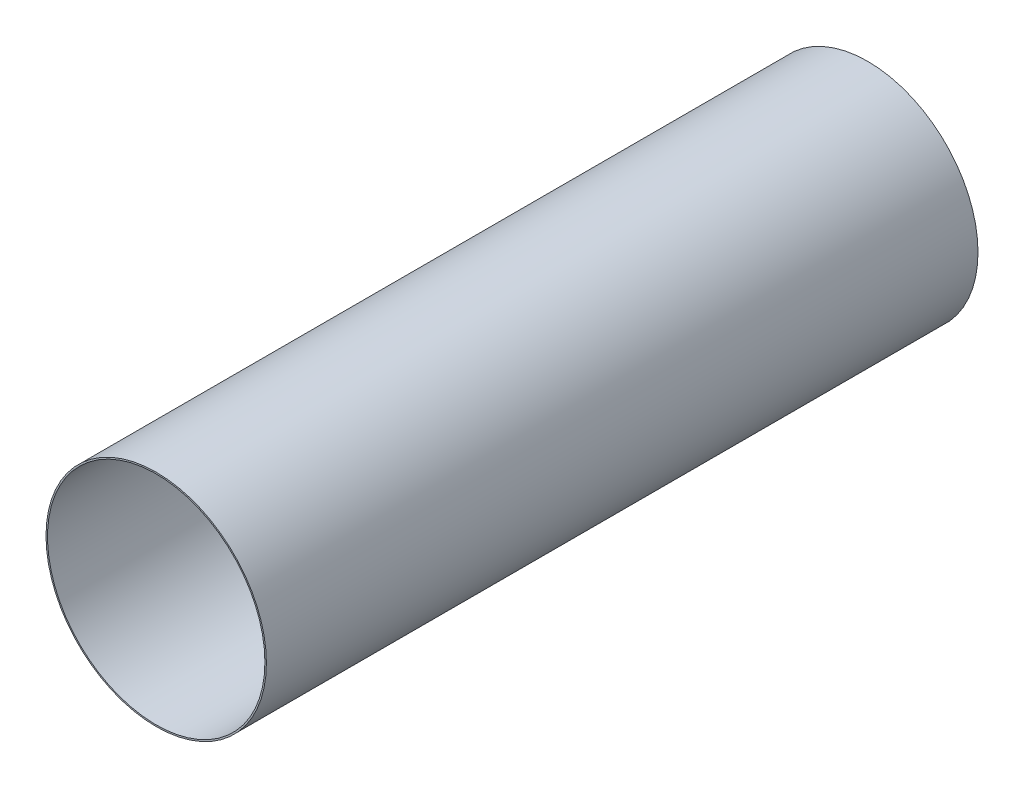
ISO-10303-21;
HEADER;
FILE_DESCRIPTION(('STEP AP214'),'2;1');
FILE_NAME('part.step','',(''),(''),'','','');
FILE_SCHEMA(('AUTOMOTIVE_DESIGN { 1 0 10303 214 1 1 1 1 }'));
ENDSEC;
DATA;
#1=APPLICATION_CONTEXT('core data for automotive mechanical design processes');
#2=APPLICATION_PROTOCOL_DEFINITION('international standard','automotive_design',2000,#1);
#3=PRODUCT_CONTEXT('',#1,'mechanical');
#4=PRODUCT('Part','Part','',(#3));
#5=PRODUCT_RELATED_PRODUCT_CATEGORY('part','',(#4));
#6=PRODUCT_DEFINITION_FORMATION('','',#4);
#7=PRODUCT_DEFINITION_CONTEXT('part definition',#1,'design');
#8=PRODUCT_DEFINITION('design','',#6,#7);
#9=PRODUCT_DEFINITION_SHAPE('','',#8);
#10=(LENGTH_UNIT() NAMED_UNIT(*) SI_UNIT(.MILLI.,.METRE.));
#11=(NAMED_UNIT(*) PLANE_ANGLE_UNIT() SI_UNIT($,.RADIAN.));
#12=(NAMED_UNIT(*) SI_UNIT($,.STERADIAN.) SOLID_ANGLE_UNIT());
#13=UNCERTAINTY_MEASURE_WITH_UNIT(LENGTH_MEASURE(1.E-05),#10,'distance_accuracy_value','');
#14=(GEOMETRIC_REPRESENTATION_CONTEXT(3) GLOBAL_UNCERTAINTY_ASSIGNED_CONTEXT((#13)) GLOBAL_UNIT_ASSIGNED_CONTEXT((#10,
#11,#12)) REPRESENTATION_CONTEXT('',''));
#15=CARTESIAN_POINT('',(0.,0.,0.));
#16=DIRECTION('',(0.,0.,1.));
#17=DIRECTION('',(1.,0.,0.));
#18=AXIS2_PLACEMENT_3D('',#15,#16,#17);
#19=CARTESIAN_POINT('',(0.,0.,457.2));
#20=DIRECTION('',(0.,0.,1.));
#21=DIRECTION('',(1.,0.,0.));
#22=AXIS2_PLACEMENT_3D('',#19,#20,#21);
#23=PLANE('',#22);
#24=CARTESIAN_POINT('',(0.,0.,457.2));
#25=DIRECTION('',(0.,0.,1.));
#26=DIRECTION('',(1.,0.,0.));
#27=AXIS2_PLACEMENT_3D('',#24,#25,#26);
#28=CIRCLE('',#27,70.8025);
#29=CARTESIAN_POINT('',(70.8025,0.,457.2));
#30=VERTEX_POINT('',#29);
#31=EDGE_CURVE('E10',#30,#30,#28,.T.);
#32=ORIENTED_EDGE('',*,*,#31,.T.);
#33=EDGE_LOOP('',(#32));
#34=FACE_BOUND('',#33,.T.);
#35=CARTESIAN_POINT('',(0.,0.,457.2));
#36=DIRECTION('',(0.,0.,1.));
#37=DIRECTION('',(1.,0.,0.));
#38=AXIS2_PLACEMENT_3D('',#35,#36,#37);
#39=CIRCLE('',#38,69.85);
#40=CARTESIAN_POINT('',(69.85,0.,457.2));
#41=VERTEX_POINT('',#40);
#42=EDGE_CURVE('E46',#41,#41,#39,.T.);
#43=ORIENTED_EDGE('',*,*,#42,.F.);
#44=EDGE_LOOP('',(#43));
#45=FACE_BOUND('',#44,.T.);
#46=ADVANCED_FACE('F35',(#34,#45),#23,.T.);
#47=CARTESIAN_POINT('',(0.,0.,0.));
#48=DIRECTION('',(0.,0.,1.));
#49=DIRECTION('',(1.,0.,0.));
#50=AXIS2_PLACEMENT_3D('',#47,#48,#49);
#51=PLANE('',#50);
#52=CARTESIAN_POINT('',(0.,0.,0.));
#53=DIRECTION('',(0.,0.,1.));
#54=DIRECTION('',(1.,0.,0.));
#55=AXIS2_PLACEMENT_3D('',#52,#53,#54);
#56=CIRCLE('',#55,70.8025);
#57=CARTESIAN_POINT('',(70.8025,0.,0.));
#58=VERTEX_POINT('',#57);
#59=EDGE_CURVE('E39',#58,#58,#56,.T.);
#60=ORIENTED_EDGE('',*,*,#59,.F.);
#61=EDGE_LOOP('',(#60));
#62=FACE_BOUND('',#61,.T.);
#63=CARTESIAN_POINT('',(0.,0.,0.));
#64=DIRECTION('',(0.,0.,1.));
#65=DIRECTION('',(1.,0.,0.));
#66=AXIS2_PLACEMENT_3D('',#63,#64,#65);
#67=CIRCLE('',#66,69.85);
#68=CARTESIAN_POINT('',(69.85,0.,0.));
#69=VERTEX_POINT('',#68);
#70=EDGE_CURVE('E48',#69,#69,#67,.T.);
#71=ORIENTED_EDGE('',*,*,#70,.T.);
#72=EDGE_LOOP('',(#71));
#73=FACE_BOUND('',#72,.T.);
#74=ADVANCED_FACE('F58',(#62,#73),#51,.F.);
#75=CARTESIAN_POINT('',(0.,0.,457.2));
#76=DIRECTION('',(0.,0.,-1.));
#77=DIRECTION('',(-1.,0.,0.));
#78=AXIS2_PLACEMENT_3D('',#75,#76,#77);
#79=CYLINDRICAL_SURFACE('',#78,70.8025);
#80=ORIENTED_EDGE('',*,*,#31,.F.);
#81=EDGE_LOOP('',(#80));
#82=FACE_BOUND('',#81,.T.);
#83=ORIENTED_EDGE('',*,*,#59,.T.);
#84=EDGE_LOOP('',(#83));
#85=FACE_BOUND('',#84,.T.);
#86=ADVANCED_FACE('F37',(#82,#85),#79,.T.);
#87=CARTESIAN_POINT('',(0.,0.,457.2));
#88=DIRECTION('',(0.,0.,-1.));
#89=DIRECTION('',(-1.,0.,0.));
#90=AXIS2_PLACEMENT_3D('',#87,#88,#89);
#91=CYLINDRICAL_SURFACE('',#90,69.85);
#92=ORIENTED_EDGE('',*,*,#42,.T.);
#93=EDGE_LOOP('',(#92));
#94=FACE_BOUND('',#93,.T.);
#95=ORIENTED_EDGE('',*,*,#70,.F.);
#96=EDGE_LOOP('',(#95));
#97=FACE_BOUND('',#96,.T.);
#98=ADVANCED_FACE('F54',(#94,#97),#91,.F.);
#99=CLOSED_SHELL('',(#46,#74,#86,#98));
#100=MANIFOLD_SOLID_BREP('B2',#99);
#101=ADVANCED_BREP_SHAPE_REPRESENTATION('',(#18,#100),#14);
#102=SHAPE_DEFINITION_REPRESENTATION(#9,#101);
ENDSEC;
END-ISO-10303-21;
